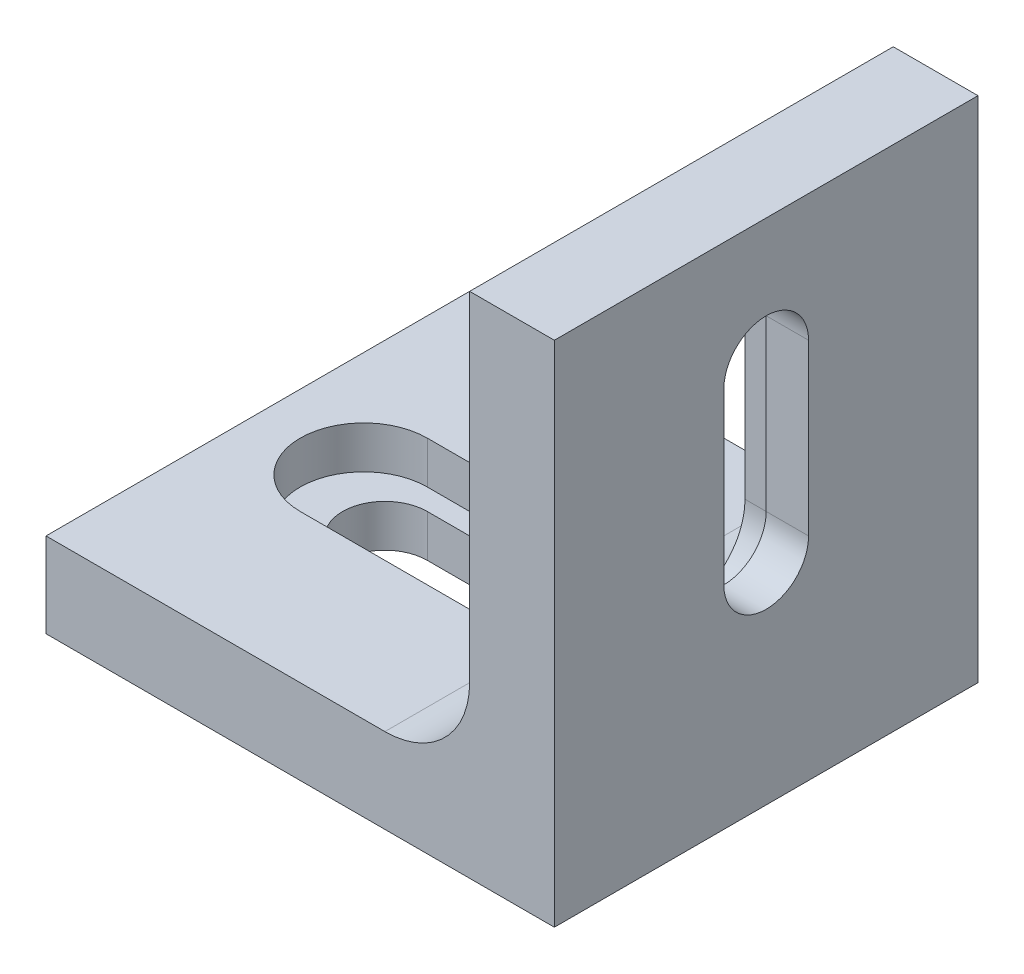
ISO-10303-21;
HEADER;
FILE_DESCRIPTION(('STEP AP214'),'2;1');
FILE_NAME('part.step','',(''),(''),'','','');
FILE_SCHEMA(('AUTOMOTIVE_DESIGN { 1 0 10303 214 1 1 1 1 }'));
ENDSEC;
DATA;
#1=APPLICATION_CONTEXT('core data for automotive mechanical design processes');
#2=APPLICATION_PROTOCOL_DEFINITION('international standard','automotive_design',2000,#1);
#3=PRODUCT_CONTEXT('',#1,'mechanical');
#4=PRODUCT('Part','Part','',(#3));
#5=PRODUCT_RELATED_PRODUCT_CATEGORY('part','',(#4));
#6=PRODUCT_DEFINITION_FORMATION('','',#4);
#7=PRODUCT_DEFINITION_CONTEXT('part definition',#1,'design');
#8=PRODUCT_DEFINITION('design','',#6,#7);
#9=PRODUCT_DEFINITION_SHAPE('','',#8);
#10=(LENGTH_UNIT() NAMED_UNIT(*) SI_UNIT(.MILLI.,.METRE.));
#11=(NAMED_UNIT(*) PLANE_ANGLE_UNIT() SI_UNIT($,.RADIAN.));
#12=(NAMED_UNIT(*) SI_UNIT($,.STERADIAN.) SOLID_ANGLE_UNIT());
#13=UNCERTAINTY_MEASURE_WITH_UNIT(LENGTH_MEASURE(1.E-05),#10,'distance_accuracy_value','');
#14=(GEOMETRIC_REPRESENTATION_CONTEXT(3) GLOBAL_UNCERTAINTY_ASSIGNED_CONTEXT((#13)) GLOBAL_UNIT_ASSIGNED_CONTEXT((#10,
#11,#12)) REPRESENTATION_CONTEXT('',''));
#15=CARTESIAN_POINT('',(0.,0.,0.));
#16=DIRECTION('',(0.,0.,1.));
#17=DIRECTION('',(1.,0.,0.));
#18=AXIS2_PLACEMENT_3D('',#15,#16,#17);
#19=CARTESIAN_POINT('',(6.,4.,-2.82842712474619));
#20=CARTESIAN_POINT('',(6.32547245768448,3.99999999999985,-2.71335420445476));
#21=CARTESIAN_POINT('',(6.52626989180735,3.99999999999995,-2.59121849655691));
#22=CARTESIAN_POINT('',(6.87169266852622,4.00000000000005,-2.35386496467723));
#23=CARTESIAN_POINT('',(7.00802456175947,3.9999999999999,-2.23515176195307));
#24=CARTESIAN_POINT('',(7.36258704874638,4.00000000000021,-1.87894844635528));
#25=CARTESIAN_POINT('',(7.52548771713491,4.,-1.64139510733595));
#26=CARTESIAN_POINT('',(7.90286763863255,4.,-0.928668009226681));
#27=CARTESIAN_POINT('',(8.00333836321145,4.,-0.453393464153569));
#28=CARTESIAN_POINT('',(7.99992241701403,4.,0.0215752612197073));
#29=CARTESIAN_POINT('',(10.,4.,-2.82842712474601));
#30=CARTESIAN_POINT('',(9.71487356592762,4.28512643407233,-2.7273002631504));
#31=CARTESIAN_POINT('',(9.60723789388118,4.39276210611887,-2.5939879391275));
#32=CARTESIAN_POINT('',(9.46755166552284,4.53244833447711,-2.35619334515371));
#33=CARTESIAN_POINT('',(9.43364752556639,4.56635247443346,-2.235994661148));
#34=CARTESIAN_POINT('',(9.36637159728851,4.63362840271179,-1.88447695941089));
#35=CARTESIAN_POINT('',(9.36211473761488,4.63788526238491,-1.64293526307065));
#36=CARTESIAN_POINT('',(9.36064682971252,4.63935317028788,-0.937725971722477));
#37=CARTESIAN_POINT('',(9.37828061713114,4.62171938286743,-0.452275232150626));
#38=CARTESIAN_POINT('',(9.37795520933664,4.62204479066336,0.023266220371759));
#39=CARTESIAN_POINT('',(10.,8.,-2.8284271247462));
#40=CARTESIAN_POINT('',(10.0000000000001,7.67452754231554,-2.71335420445469));
#41=CARTESIAN_POINT('',(10.,7.47373010819264,-2.59121849655694));
#42=CARTESIAN_POINT('',(10.,7.12830733147378,-2.3538649646772));
#43=CARTESIAN_POINT('',(9.9999999999999,6.99197543824052,-2.23515176195312));
#44=CARTESIAN_POINT('',(10.0000000000002,6.63741295125362,-1.87894844635518));
#45=CARTESIAN_POINT('',(9.9999999999998,6.47451228286488,-1.64139510733587));
#46=CARTESIAN_POINT('',(10.0000000000004,6.09713236136785,-0.928668009226834));
#47=CARTESIAN_POINT('',(9.99999999999836,5.99666163679081,-0.453393464153489));
#48=CARTESIAN_POINT('',(10.,6.00007758298597,0.0215752612197117));
#49=(BOUNDED_SURFACE() B_SPLINE_SURFACE(2,3,((#19,#20,#21,#22,#23,#24,#25,#26,#27,#28),(#29,#30,
#31,#32,#33,#34,#35,#36,#37,#38),(#39,#40,#41,#42,#43,#44,#45,#46,#47,#48)),.UNSPECIFIED.,.F.,
.F.,.F.) B_SPLINE_SURFACE_WITH_KNOTS((3,3),(4,2,2,2,4),(0.,1.),(0.,0.00039540465339184,
0.000790809306783114,0.00158161861356566,0.00316323722713076),
.UNSPECIFIED.) GEOMETRIC_REPRESENTATION_ITEM() RATIONAL_B_SPLINE_SURFACE(((1.,1.,1.,1.,1.,1.,1.,
1.,1.,1.),(0.707106781186547,0.76325819999472,0.790142989257354,0.834021234709495,
0.849023521785395,0.885991013362996,0.89958165536525,0.930028834842952,0.934909669010495,
0.935409162847284),(1.,1.,1.,1.,1.,1.,1.,1.,1.,1.))) REPRESENTATION_ITEM('') SURFACE());
#50=CARTESIAN_POINT('',(10.,6.00007758298597,0.0215752612197117));
#51=CARTESIAN_POINT('',(9.37795520933664,4.62204479066336,0.0232662203716718));
#52=CARTESIAN_POINT('',(7.99992241701403,4.,0.0215752612197073));
#53=(BOUNDED_CURVE() B_SPLINE_CURVE(2,(#50,#51,#52),.UNSPECIFIED.,.F.,
.F.) B_SPLINE_CURVE_WITH_KNOTS((3,3),(0.,1.),
.UNSPECIFIED.) CURVE() GEOMETRIC_REPRESENTATION_ITEM() RATIONAL_B_SPLINE_CURVE((1.,
0.935409162847284,1.)) REPRESENTATION_ITEM(''));
#54=CARTESIAN_POINT('',(10.,6.00007758298597,0.0215752612197117));
#55=VERTEX_POINT('',#54);
#56=CARTESIAN_POINT('',(7.99992241701403,4.,0.0215752612197073));
#57=VERTEX_POINT('',#56);
#58=EDGE_CURVE('E11',#55,#57,#53,.T.);
#59=CARTESIAN_POINT('',(10.,6.00007758298597,0.0215752612197117));
#60=CARTESIAN_POINT('',(9.99999999999836,5.99666163679081,-0.453393464153489));
#61=CARTESIAN_POINT('',(10.0000000000004,6.09713236136785,-0.928668009226834));
#62=CARTESIAN_POINT('',(9.9999999999998,6.47451228286488,-1.64139510733587));
#63=CARTESIAN_POINT('',(10.0000000000002,6.63741295125362,-1.87894844635518));
#64=CARTESIAN_POINT('',(9.9999999999999,6.99197543824052,-2.23515176195312));
#65=CARTESIAN_POINT('',(10.,7.12830733147378,-2.3538649646772));
#66=CARTESIAN_POINT('',(10.,7.47373010819264,-2.59121849655694));
#67=CARTESIAN_POINT('',(10.0000000000001,7.67452754231554,-2.71335420445469));
#68=CARTESIAN_POINT('',(10.,8.,-2.8284271247462));
#69=(BOUNDED_CURVE() B_SPLINE_CURVE(3,(#59,#60,#61,#62,#63,#64,#65,#66,#67,#68),.UNSPECIFIED.,
.F.,.F.) B_SPLINE_CURVE_WITH_KNOTS((4,2,2,2,4),(0.,0.00158161861356566,0.00237242792034821,
0.00276783257373948,0.00316323722713076),
.UNSPECIFIED.) CURVE() GEOMETRIC_REPRESENTATION_ITEM() RATIONAL_B_SPLINE_CURVE((1.,1.,1.,1.,1.,
1.,1.,1.,1.,1.)) REPRESENTATION_ITEM(''));
#70=CARTESIAN_POINT('',(10.,8.,-2.8284271247462));
#71=VERTEX_POINT('',#70);
#72=EDGE_CURVE('E290',#71,#55,#69,.F.);
#73=CARTESIAN_POINT('',(10.,8.,-2.8284271247462));
#74=CARTESIAN_POINT('',(10.,4.,-2.82842712474601));
#75=CARTESIAN_POINT('',(6.,4.,-2.82842712474619));
#76=(BOUNDED_CURVE() B_SPLINE_CURVE(2,(#73,#74,#75),.UNSPECIFIED.,.F.,
.F.) B_SPLINE_CURVE_WITH_KNOTS((3,3),(0.,1.),
.UNSPECIFIED.) CURVE() GEOMETRIC_REPRESENTATION_ITEM() RATIONAL_B_SPLINE_CURVE((1.,
0.707106781186547,1.)) REPRESENTATION_ITEM(''));
#77=CARTESIAN_POINT('',(6.,4.,-2.82842712474619));
#78=VERTEX_POINT('',#77);
#79=EDGE_CURVE('E640',#78,#71,#76,.F.);
#80=CARTESIAN_POINT('',(6.,4.,-2.82842712474619));
#81=CARTESIAN_POINT('',(6.32547245768448,3.99999999999985,-2.71335420445476));
#82=CARTESIAN_POINT('',(6.52626989180735,3.99999999999995,-2.59121849655691));
#83=CARTESIAN_POINT('',(6.87169266852622,4.00000000000005,-2.35386496467723));
#84=CARTESIAN_POINT('',(7.00802456175947,3.9999999999999,-2.23515176195307));
#85=CARTESIAN_POINT('',(7.36258704874638,4.00000000000021,-1.87894844635528));
#86=CARTESIAN_POINT('',(7.52548771713491,4.,-1.64139510733595));
#87=CARTESIAN_POINT('',(7.90286763863255,4.,-0.928668009226681));
#88=CARTESIAN_POINT('',(8.00333836321145,4.,-0.453393464153569));
#89=CARTESIAN_POINT('',(7.99992241701403,4.,0.0215752612197073));
#90=(BOUNDED_CURVE() B_SPLINE_CURVE(3,(#80,#81,#82,#83,#84,#85,#86,#87,#88,#89),.UNSPECIFIED.,
.F.,.F.) B_SPLINE_CURVE_WITH_KNOTS((4,2,2,2,4),(0.,0.00039540465339184,0.000790809306783114,
0.00158161861356566,0.00316323722713076),
.UNSPECIFIED.) CURVE() GEOMETRIC_REPRESENTATION_ITEM() RATIONAL_B_SPLINE_CURVE((1.,1.,1.,1.,1.,
1.,1.,1.,1.,1.)) REPRESENTATION_ITEM(''));
#91=EDGE_CURVE('E80',#57,#78,#90,.F.);
#92=ORIENTED_EDGE('',*,*,#58,.F.);
#93=ORIENTED_EDGE('',*,*,#72,.F.);
#94=ORIENTED_EDGE('',*,*,#79,.F.);
#95=ORIENTED_EDGE('',*,*,#91,.F.);
#96=EDGE_LOOP('',(#92,#93,#94,#95));
#97=FACE_BOUND('',#96,.T.);
#98=ADVANCED_FACE('F42',(#97),#49,.F.);
#99=CARTESIAN_POINT('',(0.,4.,0.));
#100=DIRECTION('',(0.,-1.,0.));
#101=DIRECTION('',(0.,0.,-1.));
#102=AXIS2_PLACEMENT_3D('',#99,#100,#101);
#103=PLANE('',#102);
#104=DIRECTION('',(1.,0.,0.));
#105=VECTOR('',#104,1.);
#106=CARTESIAN_POINT('',(-10.,4.,10.));
#107=LINE('',#106,#105);
#108=CARTESIAN_POINT('',(-10.,4.,10.));
#109=VERTEX_POINT('',#108);
#110=CARTESIAN_POINT('',(6.,4.,10.));
#111=VERTEX_POINT('',#110);
#112=EDGE_CURVE('E326',#109,#111,#107,.T.);
#113=ORIENTED_EDGE('',*,*,#112,.T.);
#114=DIRECTION('',(0.,0.,1.));
#115=VECTOR('',#114,1.);
#116=CARTESIAN_POINT('',(6.,4.,-10.));
#117=LINE('',#116,#115);
#118=CARTESIAN_POINT('',(6.,4.,2.82842712474619));
#119=VERTEX_POINT('',#118);
#120=EDGE_CURVE('E311',#111,#119,#117,.F.);
#121=ORIENTED_EDGE('',*,*,#120,.T.);
#122=CARTESIAN_POINT('',(5.,4.,0.));
#123=DIRECTION('',(0.,1.,0.));
#124=DIRECTION('',(0.,0.,1.));
#125=AXIS2_PLACEMENT_3D('',#122,#123,#124);
#126=CIRCLE('',#125,3.);
#127=CARTESIAN_POINT('',(5.,4.,3.));
#128=VERTEX_POINT('',#127);
#129=EDGE_CURVE('E305',#128,#119,#126,.T.);
#130=ORIENTED_EDGE('',*,*,#129,.F.);
#131=DIRECTION('',(1.,0.,0.));
#132=VECTOR('',#131,1.);
#133=CARTESIAN_POINT('',(-5.,4.,3.));
#134=LINE('',#133,#132);
#135=CARTESIAN_POINT('',(-5.,4.,3.));
#136=VERTEX_POINT('',#135);
#137=EDGE_CURVE('E296',#136,#128,#134,.T.);
#138=ORIENTED_EDGE('',*,*,#137,.F.);
#139=CARTESIAN_POINT('',(-5.,4.,0.));
#140=DIRECTION('',(0.,1.,0.));
#141=DIRECTION('',(0.,0.,1.));
#142=AXIS2_PLACEMENT_3D('',#139,#140,#141);
#143=CIRCLE('',#142,3.);
#144=CARTESIAN_POINT('',(-5.,4.,-3.));
#145=VERTEX_POINT('',#144);
#146=EDGE_CURVE('E382',#145,#136,#143,.T.);
#147=ORIENTED_EDGE('',*,*,#146,.F.);
#148=DIRECTION('',(-1.,0.,0.));
#149=VECTOR('',#148,1.);
#150=CARTESIAN_POINT('',(-5.,4.,-3.));
#151=LINE('',#150,#149);
#152=CARTESIAN_POINT('',(5.,4.,-3.));
#153=VERTEX_POINT('',#152);
#154=EDGE_CURVE('E302',#153,#145,#151,.T.);
#155=ORIENTED_EDGE('',*,*,#154,.F.);
#156=EDGE_CURVE('E293',#78,#153,#126,.T.);
#157=ORIENTED_EDGE('',*,*,#156,.F.);
#158=DIRECTION('',(0.,0.,1.));
#159=VECTOR('',#158,1.);
#160=CARTESIAN_POINT('',(6.,4.,-10.));
#161=LINE('',#160,#159);
#162=CARTESIAN_POINT('',(6.,4.,-10.));
#163=VERTEX_POINT('',#162);
#164=EDGE_CURVE('E88',#78,#163,#161,.F.);
#165=ORIENTED_EDGE('',*,*,#164,.T.);
#166=DIRECTION('',(-1.,0.,0.));
#167=VECTOR('',#166,1.);
#168=CARTESIAN_POINT('',(-10.,4.,-10.));
#169=LINE('',#168,#167);
#170=CARTESIAN_POINT('',(-10.,4.,-10.));
#171=VERTEX_POINT('',#170);
#172=EDGE_CURVE('E329',#163,#171,#169,.T.);
#173=ORIENTED_EDGE('',*,*,#172,.T.);
#174=DIRECTION('',(0.,0.,1.));
#175=VECTOR('',#174,1.);
#176=CARTESIAN_POINT('',(-10.,4.,10.));
#177=LINE('',#176,#175);
#178=EDGE_CURVE('E337',#171,#109,#177,.T.);
#179=ORIENTED_EDGE('',*,*,#178,.T.);
#180=EDGE_LOOP('',(#113,#121,#130,#138,#147,#155,#157,#165,#173,#179));
#181=FACE_BOUND('',#180,.T.);
#182=ADVANCED_FACE('F391',(#181),#103,.F.);
#183=CARTESIAN_POINT('',(-4.,4.,0.));
#184=DIRECTION('',(0.,-1.,0.));
#185=DIRECTION('',(0.,0.,-1.));
#186=AXIS2_PLACEMENT_3D('',#183,#184,#185);
#187=CYLINDRICAL_SURFACE('',#186,2.);
#188=DIRECTION('',(0.,-1.,0.));
#189=VECTOR('',#188,1.);
#190=CARTESIAN_POINT('',(-4.,4.,-2.));
#191=LINE('',#190,#189);
#192=CARTESIAN_POINT('',(-4.,2.,-2.));
#193=VERTEX_POINT('',#192);
#194=CARTESIAN_POINT('',(-4.,0.,-2.));
#195=VERTEX_POINT('',#194);
#196=EDGE_CURVE('E345',#193,#195,#191,.T.);
#197=ORIENTED_EDGE('',*,*,#196,.F.);
#198=CARTESIAN_POINT('',(-4.,2.,0.));
#199=DIRECTION('',(0.,1.,0.));
#200=DIRECTION('',(0.,0.,1.));
#201=AXIS2_PLACEMENT_3D('',#198,#199,#200);
#202=CIRCLE('',#201,2.);
#203=CARTESIAN_POINT('',(-4.,2.,2.));
#204=VERTEX_POINT('',#203);
#205=EDGE_CURVE('E359',#193,#204,#202,.T.);
#206=ORIENTED_EDGE('',*,*,#205,.T.);
#207=DIRECTION('',(0.,-1.,0.));
#208=VECTOR('',#207,1.);
#209=CARTESIAN_POINT('',(-4.,4.,2.));
#210=LINE('',#209,#208);
#211=CARTESIAN_POINT('',(-4.,0.,2.));
#212=VERTEX_POINT('',#211);
#213=EDGE_CURVE('E334',#204,#212,#210,.T.);
#214=ORIENTED_EDGE('',*,*,#213,.T.);
#215=CARTESIAN_POINT('',(-4.,0.,0.));
#216=DIRECTION('',(0.,1.,0.));
#217=DIRECTION('',(0.,0.,1.));
#218=AXIS2_PLACEMENT_3D('',#215,#216,#217);
#219=CIRCLE('',#218,2.);
#220=EDGE_CURVE('E356',#195,#212,#219,.T.);
#221=ORIENTED_EDGE('',*,*,#220,.F.);
#222=EDGE_LOOP('',(#197,#206,#214,#221));
#223=FACE_BOUND('',#222,.T.);
#224=ADVANCED_FACE('F599',(#223),#187,.F.);
#225=CARTESIAN_POINT('',(-4.,4.,2.));
#226=DIRECTION('',(0.,0.,-1.));
#227=DIRECTION('',(-1.,0.,0.));
#228=AXIS2_PLACEMENT_3D('',#225,#226,#227);
#229=PLANE('',#228);
#230=ORIENTED_EDGE('',*,*,#213,.F.);
#231=DIRECTION('',(1.,0.,0.));
#232=VECTOR('',#231,1.);
#233=CARTESIAN_POINT('',(-4.,2.,2.));
#234=LINE('',#233,#232);
#235=CARTESIAN_POINT('',(4.,2.,2.));
#236=VERTEX_POINT('',#235);
#237=EDGE_CURVE('E362',#204,#236,#234,.T.);
#238=ORIENTED_EDGE('',*,*,#237,.T.);
#239=DIRECTION('',(0.,-1.,0.));
#240=VECTOR('',#239,1.);
#241=CARTESIAN_POINT('',(4.,4.,2.));
#242=LINE('',#241,#240);
#243=CARTESIAN_POINT('',(4.,0.,2.));
#244=VERTEX_POINT('',#243);
#245=EDGE_CURVE('E341',#236,#244,#242,.T.);
#246=ORIENTED_EDGE('',*,*,#245,.T.);
#247=DIRECTION('',(1.,0.,0.));
#248=VECTOR('',#247,1.);
#249=CARTESIAN_POINT('',(-4.,0.,2.));
#250=LINE('',#249,#248);
#251=EDGE_CURVE('E353',#212,#244,#250,.T.);
#252=ORIENTED_EDGE('',*,*,#251,.F.);
#253=EDGE_LOOP('',(#230,#238,#246,#252));
#254=FACE_BOUND('',#253,.T.);
#255=ADVANCED_FACE('F669',(#254),#229,.T.);
#256=CARTESIAN_POINT('',(4.,4.,0.));
#257=DIRECTION('',(0.,-1.,0.));
#258=DIRECTION('',(0.,0.,-1.));
#259=AXIS2_PLACEMENT_3D('',#256,#257,#258);
#260=CYLINDRICAL_SURFACE('',#259,2.);
#261=ORIENTED_EDGE('',*,*,#245,.F.);
#262=CARTESIAN_POINT('',(4.,2.,0.));
#263=DIRECTION('',(0.,1.,0.));
#264=DIRECTION('',(0.,0.,1.));
#265=AXIS2_PLACEMENT_3D('',#262,#263,#264);
#266=CIRCLE('',#265,2.);
#267=CARTESIAN_POINT('',(4.,2.,-2.));
#268=VERTEX_POINT('',#267);
#269=EDGE_CURVE('E365',#236,#268,#266,.T.);
#270=ORIENTED_EDGE('',*,*,#269,.T.);
#271=DIRECTION('',(0.,-1.,0.));
#272=VECTOR('',#271,1.);
#273=CARTESIAN_POINT('',(4.,4.,-2.));
#274=LINE('',#273,#272);
#275=CARTESIAN_POINT('',(4.,0.,-2.));
#276=VERTEX_POINT('',#275);
#277=EDGE_CURVE('E343',#268,#276,#274,.T.);
#278=ORIENTED_EDGE('',*,*,#277,.T.);
#279=CARTESIAN_POINT('',(4.,0.,0.));
#280=DIRECTION('',(0.,1.,0.));
#281=DIRECTION('',(0.,0.,1.));
#282=AXIS2_PLACEMENT_3D('',#279,#280,#281);
#283=CIRCLE('',#282,2.);
#284=EDGE_CURVE('E350',#244,#276,#283,.T.);
#285=ORIENTED_EDGE('',*,*,#284,.F.);
#286=EDGE_LOOP('',(#261,#270,#278,#285));
#287=FACE_BOUND('',#286,.T.);
#288=ADVANCED_FACE('F673',(#287),#260,.F.);
#289=CARTESIAN_POINT('',(-4.,4.,-2.));
#290=DIRECTION('',(0.,0.,1.));
#291=DIRECTION('',(1.,0.,0.));
#292=AXIS2_PLACEMENT_3D('',#289,#290,#291);
#293=PLANE('',#292);
#294=ORIENTED_EDGE('',*,*,#277,.F.);
#295=DIRECTION('',(-1.,0.,0.));
#296=VECTOR('',#295,1.);
#297=CARTESIAN_POINT('',(-4.,2.,-2.));
#298=LINE('',#297,#296);
#299=EDGE_CURVE('E316',#268,#193,#298,.T.);
#300=ORIENTED_EDGE('',*,*,#299,.T.);
#301=ORIENTED_EDGE('',*,*,#196,.T.);
#302=DIRECTION('',(-1.,0.,0.));
#303=VECTOR('',#302,1.);
#304=CARTESIAN_POINT('',(-4.,0.,-2.));
#305=LINE('',#304,#303);
#306=EDGE_CURVE('E347',#276,#195,#305,.T.);
#307=ORIENTED_EDGE('',*,*,#306,.F.);
#308=EDGE_LOOP('',(#294,#300,#301,#307));
#309=FACE_BOUND('',#308,.T.);
#310=ADVANCED_FACE('F664',(#309),#293,.T.);
#311=CARTESIAN_POINT('',(0.,0.,0.));
#312=DIRECTION('',(0.,-1.,0.));
#313=DIRECTION('',(0.,0.,-1.));
#314=AXIS2_PLACEMENT_3D('',#311,#312,#313);
#315=PLANE('',#314);
#316=DIRECTION('',(-1.,0.,0.));
#317=VECTOR('',#316,1.);
#318=CARTESIAN_POINT('',(-10.,0.,-10.));
#319=LINE('',#318,#317);
#320=CARTESIAN_POINT('',(14.,0.,-10.));
#321=VERTEX_POINT('',#320);
#322=CARTESIAN_POINT('',(-10.,0.,-10.));
#323=VERTEX_POINT('',#322);
#324=EDGE_CURVE('E332',#321,#323,#319,.T.);
#325=ORIENTED_EDGE('',*,*,#324,.F.);
#326=DIRECTION('',(0.,0.,-1.));
#327=VECTOR('',#326,1.);
#328=CARTESIAN_POINT('',(14.,0.,10.));
#329=LINE('',#328,#327);
#330=CARTESIAN_POINT('',(14.,0.,10.));
#331=VERTEX_POINT('',#330);
#332=EDGE_CURVE('E394',#331,#321,#329,.T.);
#333=ORIENTED_EDGE('',*,*,#332,.F.);
#334=DIRECTION('',(1.,0.,0.));
#335=VECTOR('',#334,1.);
#336=CARTESIAN_POINT('',(-10.,0.,10.));
#337=LINE('',#336,#335);
#338=CARTESIAN_POINT('',(-10.,0.,10.));
#339=VERTEX_POINT('',#338);
#340=EDGE_CURVE('E327',#339,#331,#337,.T.);
#341=ORIENTED_EDGE('',*,*,#340,.F.);
#342=DIRECTION('',(0.,0.,1.));
#343=VECTOR('',#342,1.);
#344=CARTESIAN_POINT('',(-10.,0.,10.));
#345=LINE('',#344,#343);
#346=EDGE_CURVE('E330',#323,#339,#345,.T.);
#347=ORIENTED_EDGE('',*,*,#346,.F.);
#348=EDGE_LOOP('',(#325,#333,#341,#347));
#349=FACE_BOUND('',#348,.T.);
#350=ORIENTED_EDGE('',*,*,#306,.T.);
#351=ORIENTED_EDGE('',*,*,#220,.T.);
#352=ORIENTED_EDGE('',*,*,#251,.T.);
#353=ORIENTED_EDGE('',*,*,#284,.T.);
#354=EDGE_LOOP('',(#350,#351,#352,#353));
#355=FACE_BOUND('',#354,.T.);
#356=ADVANCED_FACE('F657',(#349,#355),#315,.T.);
#357=CARTESIAN_POINT('',(-10.,4.,-10.));
#358=DIRECTION('',(0.,0.,1.));
#359=DIRECTION('',(1.,0.,0.));
#360=AXIS2_PLACEMENT_3D('',#357,#358,#359);
#361=PLANE('',#360);
#362=ORIENTED_EDGE('',*,*,#324,.T.);
#363=DIRECTION('',(0.,-1.,0.));
#364=VECTOR('',#363,1.);
#365=CARTESIAN_POINT('',(-10.,4.,-10.));
#366=LINE('',#365,#364);
#367=EDGE_CURVE('E320',#171,#323,#366,.T.);
#368=ORIENTED_EDGE('',*,*,#367,.F.);
#369=ORIENTED_EDGE('',*,*,#172,.F.);
#370=CARTESIAN_POINT('',(6.,8.,-10.));
#371=DIRECTION('',(0.,0.,1.));
#372=DIRECTION('',(1.,0.,0.));
#373=AXIS2_PLACEMENT_3D('',#370,#371,#372);
#374=CIRCLE('',#373,4.);
#375=CARTESIAN_POINT('',(10.,8.,-10.));
#376=VERTEX_POINT('',#375);
#377=EDGE_CURVE('E56',#163,#376,#374,.T.);
#378=ORIENTED_EDGE('',*,*,#377,.T.);
#379=DIRECTION('',(0.,-1.,0.));
#380=VECTOR('',#379,1.);
#381=CARTESIAN_POINT('',(10.,24.,-10.));
#382=LINE('',#381,#380);
#383=CARTESIAN_POINT('',(10.,24.,-10.));
#384=VERTEX_POINT('',#383);
#385=EDGE_CURVE('E411',#384,#376,#382,.T.);
#386=ORIENTED_EDGE('',*,*,#385,.F.);
#387=DIRECTION('',(-1.,0.,0.));
#388=VECTOR('',#387,1.);
#389=CARTESIAN_POINT('',(14.,24.,-10.));
#390=LINE('',#389,#388);
#391=CARTESIAN_POINT('',(14.,24.,-10.));
#392=VERTEX_POINT('',#391);
#393=EDGE_CURVE('E422',#392,#384,#390,.T.);
#394=ORIENTED_EDGE('',*,*,#393,.F.);
#395=DIRECTION('',(0.,1.,0.));
#396=VECTOR('',#395,1.);
#397=CARTESIAN_POINT('',(14.,0.,-10.));
#398=LINE('',#397,#396);
#399=EDGE_CURVE('E409',#321,#392,#398,.T.);
#400=ORIENTED_EDGE('',*,*,#399,.F.);
#401=EDGE_LOOP('',(#362,#368,#369,#378,#386,#394,#400));
#402=FACE_BOUND('',#401,.T.);
#403=ADVANCED_FACE('F653',(#402),#361,.F.);
#404=CARTESIAN_POINT('',(-10.,4.,10.));
#405=DIRECTION('',(1.,0.,0.));
#406=DIRECTION('',(0.,0.,-1.));
#407=AXIS2_PLACEMENT_3D('',#404,#405,#406);
#408=PLANE('',#407);
#409=ORIENTED_EDGE('',*,*,#346,.T.);
#410=DIRECTION('',(0.,-1.,0.));
#411=VECTOR('',#410,1.);
#412=CARTESIAN_POINT('',(-10.,4.,10.));
#413=LINE('',#412,#411);
#414=EDGE_CURVE('E323',#109,#339,#413,.T.);
#415=ORIENTED_EDGE('',*,*,#414,.F.);
#416=ORIENTED_EDGE('',*,*,#178,.F.);
#417=ORIENTED_EDGE('',*,*,#367,.T.);
#418=EDGE_LOOP('',(#409,#415,#416,#417));
#419=FACE_BOUND('',#418,.T.);
#420=ADVANCED_FACE('F656',(#419),#408,.F.);
#421=CARTESIAN_POINT('',(-10.,4.,10.));
#422=DIRECTION('',(0.,0.,-1.));
#423=DIRECTION('',(-1.,0.,0.));
#424=AXIS2_PLACEMENT_3D('',#421,#422,#423);
#425=PLANE('',#424);
#426=ORIENTED_EDGE('',*,*,#340,.T.);
#427=DIRECTION('',(0.,-1.,0.));
#428=VECTOR('',#427,1.);
#429=CARTESIAN_POINT('',(14.,0.,10.));
#430=LINE('',#429,#428);
#431=CARTESIAN_POINT('',(14.,24.,10.));
#432=VERTEX_POINT('',#431);
#433=EDGE_CURVE('E396',#432,#331,#430,.T.);
#434=ORIENTED_EDGE('',*,*,#433,.F.);
#435=DIRECTION('',(1.,0.,0.));
#436=VECTOR('',#435,1.);
#437=CARTESIAN_POINT('',(14.,24.,10.));
#438=LINE('',#437,#436);
#439=CARTESIAN_POINT('',(10.,24.,10.));
#440=VERTEX_POINT('',#439);
#441=EDGE_CURVE('E417',#440,#432,#438,.T.);
#442=ORIENTED_EDGE('',*,*,#441,.F.);
#443=DIRECTION('',(0.,-1.,0.));
#444=VECTOR('',#443,1.);
#445=CARTESIAN_POINT('',(10.,24.,10.));
#446=LINE('',#445,#444);
#447=CARTESIAN_POINT('',(10.,8.,10.));
#448=VERTEX_POINT('',#447);
#449=EDGE_CURVE('E414',#440,#448,#446,.T.);
#450=ORIENTED_EDGE('',*,*,#449,.T.);
#451=CARTESIAN_POINT('',(6.,8.,10.));
#452=DIRECTION('',(0.,0.,-1.));
#453=DIRECTION('',(-1.,0.,0.));
#454=AXIS2_PLACEMENT_3D('',#451,#452,#453);
#455=CIRCLE('',#454,4.);
#456=EDGE_CURVE('E313',#448,#111,#455,.T.);
#457=ORIENTED_EDGE('',*,*,#456,.T.);
#458=ORIENTED_EDGE('',*,*,#112,.F.);
#459=ORIENTED_EDGE('',*,*,#414,.T.);
#460=EDGE_LOOP('',(#426,#434,#442,#450,#457,#458,#459));
#461=FACE_BOUND('',#460,.T.);
#462=ADVANCED_FACE('F571',(#461),#425,.F.);
#463=CARTESIAN_POINT('',(-5.,2.,0.));
#464=DIRECTION('',(0.,1.,0.));
#465=DIRECTION('',(0.,0.,1.));
#466=AXIS2_PLACEMENT_3D('',#463,#464,#465);
#467=CYLINDRICAL_SURFACE('',#466,3.);
#468=ORIENTED_EDGE('',*,*,#146,.T.);
#469=DIRECTION('',(0.,1.,0.));
#470=VECTOR('',#469,1.);
#471=CARTESIAN_POINT('',(-5.,2.,3.));
#472=LINE('',#471,#470);
#473=CARTESIAN_POINT('',(-5.,2.,3.));
#474=VERTEX_POINT('',#473);
#475=EDGE_CURVE('E369',#474,#136,#472,.T.);
#476=ORIENTED_EDGE('',*,*,#475,.F.);
#477=CARTESIAN_POINT('',(-5.,2.,0.));
#478=DIRECTION('',(0.,1.,0.));
#479=DIRECTION('',(0.,0.,1.));
#480=AXIS2_PLACEMENT_3D('',#477,#478,#479);
#481=CIRCLE('',#480,3.);
#482=CARTESIAN_POINT('',(-5.,2.,-3.));
#483=VERTEX_POINT('',#482);
#484=EDGE_CURVE('E384',#483,#474,#481,.T.);
#485=ORIENTED_EDGE('',*,*,#484,.F.);
#486=DIRECTION('',(0.,1.,0.));
#487=VECTOR('',#486,1.);
#488=CARTESIAN_POINT('',(-5.,2.,-3.));
#489=LINE('',#488,#487);
#490=EDGE_CURVE('E368',#483,#145,#489,.T.);
#491=ORIENTED_EDGE('',*,*,#490,.T.);
#492=EDGE_LOOP('',(#468,#476,#485,#491));
#493=FACE_BOUND('',#492,.T.);
#494=ADVANCED_FACE('F380',(#493),#467,.F.);
#495=CARTESIAN_POINT('',(-5.,2.,-3.));
#496=DIRECTION('',(0.,0.,-1.));
#497=DIRECTION('',(-1.,0.,0.));
#498=AXIS2_PLACEMENT_3D('',#495,#496,#497);
#499=PLANE('',#498);
#500=ORIENTED_EDGE('',*,*,#154,.T.);
#501=ORIENTED_EDGE('',*,*,#490,.F.);
#502=DIRECTION('',(-1.,0.,0.));
#503=VECTOR('',#502,1.);
#504=CARTESIAN_POINT('',(-5.,2.,-3.));
#505=LINE('',#504,#503);
#506=CARTESIAN_POINT('',(5.,2.,-3.));
#507=VERTEX_POINT('',#506);
#508=EDGE_CURVE('E373',#507,#483,#505,.T.);
#509=ORIENTED_EDGE('',*,*,#508,.F.);
#510=DIRECTION('',(0.,1.,0.));
#511=VECTOR('',#510,1.);
#512=CARTESIAN_POINT('',(5.,2.,-3.));
#513=LINE('',#512,#511);
#514=EDGE_CURVE('E375',#507,#153,#513,.T.);
#515=ORIENTED_EDGE('',*,*,#514,.T.);
#516=EDGE_LOOP('',(#500,#501,#509,#515));
#517=FACE_BOUND('',#516,.T.);
#518=ADVANCED_FACE('F389',(#517),#499,.F.);
#519=CARTESIAN_POINT('',(5.,2.,0.));
#520=DIRECTION('',(0.,1.,0.));
#521=DIRECTION('',(0.,0.,1.));
#522=AXIS2_PLACEMENT_3D('',#519,#520,#521);
#523=CYLINDRICAL_SURFACE('',#522,3.);
#524=ORIENTED_EDGE('',*,*,#129,.T.);
#525=CARTESIAN_POINT('',(7.99992241701403,4.,0.0215752612197073));
#526=CARTESIAN_POINT('',(7.99655780397247,3.9999999999998,0.489406393847172));
#527=CARTESIAN_POINT('',(7.89251532351298,4.00000000000021,0.956942216341228));
#528=CARTESIAN_POINT('',(7.51400031076357,3.9999999999999,1.658432443956));
#529=CARTESIAN_POINT('',(7.35142896395605,3.9999999999999,1.89228535250882));
#530=CARTESIAN_POINT('',(6.99889606364039,4.00000000000005,2.24319077819157));
#531=CARTESIAN_POINT('',(6.86348952920445,3.99999999999995,2.3601803860819));
#532=CARTESIAN_POINT('',(6.52085658895563,4.00000000000005,2.59423192543343));
#533=CARTESIAN_POINT('',(6.3217072994237,3.99999999999975,2.71468540927684));
#534=CARTESIAN_POINT('',(6.,4.,2.82842712474619));
#535=(BOUNDED_CURVE() B_SPLINE_CURVE(3,(#525,#526,#527,#528,#529,#530,#531,#532,#533,#534),
.UNSPECIFIED.,.F.,.F.) B_SPLINE_CURVE_WITH_KNOTS((4,2,2,2,4),(6.28002206995246,6.28160368856602,
6.2823944978728,6.2827899025262,6.28318530717959),
.UNSPECIFIED.) CURVE() GEOMETRIC_REPRESENTATION_ITEM() RATIONAL_B_SPLINE_CURVE((1.,1.,1.,1.,1.,
1.,1.,1.,1.,1.)) REPRESENTATION_ITEM(''));
#536=EDGE_CURVE('E308',#119,#57,#535,.F.);
#537=ORIENTED_EDGE('',*,*,#536,.T.);
#538=ORIENTED_EDGE('',*,*,#91,.T.);
#539=ORIENTED_EDGE('',*,*,#156,.T.);
#540=ORIENTED_EDGE('',*,*,#514,.F.);
#541=CARTESIAN_POINT('',(5.,2.,0.));
#542=DIRECTION('',(0.,1.,0.));
#543=DIRECTION('',(0.,0.,1.));
#544=AXIS2_PLACEMENT_3D('',#541,#542,#543);
#545=CIRCLE('',#544,3.);
#546=CARTESIAN_POINT('',(5.,2.,3.));
#547=VERTEX_POINT('',#546);
#548=EDGE_CURVE('E400',#547,#507,#545,.T.);
#549=ORIENTED_EDGE('',*,*,#548,.F.);
#550=DIRECTION('',(0.,1.,0.));
#551=VECTOR('',#550,1.);
#552=CARTESIAN_POINT('',(5.,2.,3.));
#553=LINE('',#552,#551);
#554=EDGE_CURVE('E372',#547,#128,#553,.T.);
#555=ORIENTED_EDGE('',*,*,#554,.T.);
#556=EDGE_LOOP('',(#524,#537,#538,#539,#540,#549,#555));
#557=FACE_BOUND('',#556,.T.);
#558=ADVANCED_FACE('F573',(#557),#523,.F.);
#559=CARTESIAN_POINT('',(-5.,2.,3.));
#560=DIRECTION('',(0.,0.,1.));
#561=DIRECTION('',(1.,0.,0.));
#562=AXIS2_PLACEMENT_3D('',#559,#560,#561);
#563=PLANE('',#562);
#564=ORIENTED_EDGE('',*,*,#137,.T.);
#565=ORIENTED_EDGE('',*,*,#554,.F.);
#566=DIRECTION('',(1.,0.,0.));
#567=VECTOR('',#566,1.);
#568=CARTESIAN_POINT('',(-5.,2.,3.));
#569=LINE('',#568,#567);
#570=EDGE_CURVE('E403',#474,#547,#569,.T.);
#571=ORIENTED_EDGE('',*,*,#570,.F.);
#572=ORIENTED_EDGE('',*,*,#475,.T.);
#573=EDGE_LOOP('',(#564,#565,#571,#572));
#574=FACE_BOUND('',#573,.T.);
#575=ADVANCED_FACE('F578',(#574),#563,.F.);
#576=CARTESIAN_POINT('',(-5.,2.,0.));
#577=DIRECTION('',(0.,1.,0.));
#578=DIRECTION('',(0.,0.,1.));
#579=AXIS2_PLACEMENT_3D('',#576,#577,#578);
#580=PLANE('',#579);
#581=ORIENTED_EDGE('',*,*,#299,.F.);
#582=ORIENTED_EDGE('',*,*,#269,.F.);
#583=ORIENTED_EDGE('',*,*,#237,.F.);
#584=ORIENTED_EDGE('',*,*,#205,.F.);
#585=EDGE_LOOP('',(#581,#582,#583,#584));
#586=FACE_BOUND('',#585,.T.);
#587=ORIENTED_EDGE('',*,*,#484,.T.);
#588=ORIENTED_EDGE('',*,*,#570,.T.);
#589=ORIENTED_EDGE('',*,*,#548,.T.);
#590=ORIENTED_EDGE('',*,*,#508,.T.);
#591=EDGE_LOOP('',(#587,#588,#589,#590));
#592=FACE_BOUND('',#591,.T.);
#593=ADVANCED_FACE('F580',(#586,#592),#580,.T.);
#594=CARTESIAN_POINT('',(14.,0.,0.));
#595=DIRECTION('',(-1.,0.,0.));
#596=DIRECTION('',(0.,0.,1.));
#597=AXIS2_PLACEMENT_3D('',#594,#595,#596);
#598=PLANE('',#597);
#599=DIRECTION('',(0.,1.,0.));
#600=VECTOR('',#599,1.);
#601=CARTESIAN_POINT('',(14.,10.,-2.));
#602=LINE('',#601,#600);
#603=CARTESIAN_POINT('',(14.,10.,-2.));
#604=VERTEX_POINT('',#603);
#605=CARTESIAN_POINT('',(14.,18.,-2.00000000000001));
#606=VERTEX_POINT('',#605);
#607=EDGE_CURVE('E875',#604,#606,#602,.T.);
#608=ORIENTED_EDGE('',*,*,#607,.F.);
#609=CARTESIAN_POINT('',(14.,10.,0.));
#610=DIRECTION('',(-1.,0.,0.));
#611=DIRECTION('',(0.,0.,1.));
#612=AXIS2_PLACEMENT_3D('',#609,#610,#611);
#613=CIRCLE('',#612,2.);
#614=CARTESIAN_POINT('',(14.,10.,2.));
#615=VERTEX_POINT('',#614);
#616=EDGE_CURVE('E262',#615,#604,#613,.F.);
#617=ORIENTED_EDGE('',*,*,#616,.F.);
#618=DIRECTION('',(0.,-1.,0.));
#619=VECTOR('',#618,1.);
#620=CARTESIAN_POINT('',(14.,10.,2.));
#621=LINE('',#620,#619);
#622=CARTESIAN_POINT('',(14.,18.,2.));
#623=VERTEX_POINT('',#622);
#624=EDGE_CURVE('E230',#623,#615,#621,.T.);
#625=ORIENTED_EDGE('',*,*,#624,.F.);
#626=CARTESIAN_POINT('',(14.,18.,0.));
#627=DIRECTION('',(-1.,0.,0.));
#628=DIRECTION('',(0.,0.,1.));
#629=AXIS2_PLACEMENT_3D('',#626,#627,#628);
#630=CIRCLE('',#629,2.);
#631=EDGE_CURVE('E255',#606,#623,#630,.F.);
#632=ORIENTED_EDGE('',*,*,#631,.F.);
#633=EDGE_LOOP('',(#608,#617,#625,#632));
#634=FACE_BOUND('',#633,.T.);
#635=ORIENTED_EDGE('',*,*,#399,.T.);
#636=DIRECTION('',(0.,0.,-1.));
#637=VECTOR('',#636,1.);
#638=CARTESIAN_POINT('',(14.,24.,-10.));
#639=LINE('',#638,#637);
#640=EDGE_CURVE('E424',#432,#392,#639,.T.);
#641=ORIENTED_EDGE('',*,*,#640,.F.);
#642=ORIENTED_EDGE('',*,*,#433,.T.);
#643=ORIENTED_EDGE('',*,*,#332,.T.);
#644=EDGE_LOOP('',(#635,#641,#642,#643));
#645=FACE_BOUND('',#644,.T.);
#646=ADVANCED_FACE('F582',(#634,#645),#598,.F.);
#647=CARTESIAN_POINT('',(10.,24.,-10.));
#648=DIRECTION('',(1.,0.,0.));
#649=DIRECTION('',(0.,0.,-1.));
#650=AXIS2_PLACEMENT_3D('',#647,#648,#649);
#651=PLANE('',#650);
#652=ORIENTED_EDGE('',*,*,#385,.T.);
#653=DIRECTION('',(0.,0.,1.));
#654=VECTOR('',#653,1.);
#655=CARTESIAN_POINT('',(10.,8.,10.));
#656=LINE('',#655,#654);
#657=EDGE_CURVE('E558',#376,#71,#656,.T.);
#658=ORIENTED_EDGE('',*,*,#657,.T.);
#659=CARTESIAN_POINT('',(10.,9.,0.));
#660=DIRECTION('',(-1.,0.,0.));
#661=DIRECTION('',(0.,0.,1.));
#662=AXIS2_PLACEMENT_3D('',#659,#660,#661);
#663=CIRCLE('',#662,3.);
#664=CARTESIAN_POINT('',(10.,9.,-3.));
#665=VERTEX_POINT('',#664);
#666=EDGE_CURVE('E286',#665,#71,#663,.T.);
#667=ORIENTED_EDGE('',*,*,#666,.F.);
#668=DIRECTION('',(0.,-1.,0.));
#669=VECTOR('',#668,1.);
#670=CARTESIAN_POINT('',(10.,9.,-3.));
#671=LINE('',#670,#669);
#672=CARTESIAN_POINT('',(10.,19.,-3.));
#673=VERTEX_POINT('',#672);
#674=EDGE_CURVE('E267',#673,#665,#671,.T.);
#675=ORIENTED_EDGE('',*,*,#674,.F.);
#676=CARTESIAN_POINT('',(10.,19.,0.));
#677=DIRECTION('',(-1.,0.,0.));
#678=DIRECTION('',(0.,0.,1.));
#679=AXIS2_PLACEMENT_3D('',#676,#677,#678);
#680=CIRCLE('',#679,3.);
#681=CARTESIAN_POINT('',(10.,19.,3.));
#682=VERTEX_POINT('',#681);
#683=EDGE_CURVE('E436',#682,#673,#680,.T.);
#684=ORIENTED_EDGE('',*,*,#683,.F.);
#685=DIRECTION('',(0.,1.,0.));
#686=VECTOR('',#685,1.);
#687=CARTESIAN_POINT('',(10.,9.,3.));
#688=LINE('',#687,#686);
#689=CARTESIAN_POINT('',(10.,9.,3.));
#690=VERTEX_POINT('',#689);
#691=EDGE_CURVE('E279',#690,#682,#688,.T.);
#692=ORIENTED_EDGE('',*,*,#691,.F.);
#693=CARTESIAN_POINT('',(10.,8.,2.82842712474619));
#694=VERTEX_POINT('',#693);
#695=EDGE_CURVE('E261',#694,#690,#663,.T.);
#696=ORIENTED_EDGE('',*,*,#695,.F.);
#697=DIRECTION('',(0.,0.,1.));
#698=VECTOR('',#697,1.);
#699=CARTESIAN_POINT('',(10.,8.,10.));
#700=LINE('',#699,#698);
#701=EDGE_CURVE('E319',#694,#448,#700,.T.);
#702=ORIENTED_EDGE('',*,*,#701,.T.);
#703=ORIENTED_EDGE('',*,*,#449,.F.);
#704=DIRECTION('',(0.,0.,1.));
#705=VECTOR('',#704,1.);
#706=CARTESIAN_POINT('',(10.,24.,-10.));
#707=LINE('',#706,#705);
#708=EDGE_CURVE('E420',#384,#440,#707,.T.);
#709=ORIENTED_EDGE('',*,*,#708,.F.);
#710=EDGE_LOOP('',(#652,#658,#667,#675,#684,#692,#696,#702,#703,#709));
#711=FACE_BOUND('',#710,.T.);
#712=ADVANCED_FACE('F449',(#711),#651,.F.);
#713=CARTESIAN_POINT('',(0.,24.,0.));
#714=DIRECTION('',(0.,-1.,0.));
#715=DIRECTION('',(0.,0.,-1.));
#716=AXIS2_PLACEMENT_3D('',#713,#714,#715);
#717=PLANE('',#716);
#718=ORIENTED_EDGE('',*,*,#640,.T.);
#719=ORIENTED_EDGE('',*,*,#393,.T.);
#720=ORIENTED_EDGE('',*,*,#708,.T.);
#721=ORIENTED_EDGE('',*,*,#441,.T.);
#722=EDGE_LOOP('',(#718,#719,#720,#721));
#723=FACE_BOUND('',#722,.T.);
#724=ADVANCED_FACE('F484',(#723),#717,.F.);
#725=CARTESIAN_POINT('',(12.,9.,0.));
#726=DIRECTION('',(-1.,0.,0.));
#727=DIRECTION('',(0.,0.,1.));
#728=AXIS2_PLACEMENT_3D('',#725,#726,#727);
#729=CYLINDRICAL_SURFACE('',#728,3.);
#730=ORIENTED_EDGE('',*,*,#666,.T.);
#731=ORIENTED_EDGE('',*,*,#72,.T.);
#732=CARTESIAN_POINT('',(10.,8.,2.82842712474619));
#733=CARTESIAN_POINT('',(10.0000000000001,7.67829270057633,2.71468540927678));
#734=CARTESIAN_POINT('',(10.,7.47914341104437,2.59423192543338));
#735=CARTESIAN_POINT('',(10.,7.13651047079554,2.36018038608195));
#736=CARTESIAN_POINT('',(10.0000000000002,7.00110393635976,2.24319077819162));
#737=CARTESIAN_POINT('',(9.99999999999959,6.64857103604364,1.89228535250871));
#738=CARTESIAN_POINT('',(9.99999999999979,6.48599968923674,1.65843244395597));
#739=CARTESIAN_POINT('',(10.0000000000004,6.10748467648641,0.95694221634128));
#740=CARTESIAN_POINT('',(9.99999999999837,6.00344219602427,0.489406393847137));
#741=CARTESIAN_POINT('',(10.,6.00007758298597,0.0215752612197117));
#742=(BOUNDED_CURVE() B_SPLINE_CURVE(3,(#732,#733,#734,#735,#736,#737,#738,#739,#740,#741),
.UNSPECIFIED.,.F.,.F.) B_SPLINE_CURVE_WITH_KNOTS((4,2,2,2,4),(6.28002206995246,6.28041747460585,
6.28081287925924,6.28160368856602,6.28318530717959),
.UNSPECIFIED.) CURVE() GEOMETRIC_REPRESENTATION_ITEM() RATIONAL_B_SPLINE_CURVE((1.,1.,1.,1.,1.,
1.,1.,1.,1.,1.)) REPRESENTATION_ITEM(''));
#743=EDGE_CURVE('E461',#55,#694,#742,.F.);
#744=ORIENTED_EDGE('',*,*,#743,.T.);
#745=ORIENTED_EDGE('',*,*,#695,.T.);
#746=DIRECTION('',(-1.,0.,0.));
#747=VECTOR('',#746,1.);
#748=CARTESIAN_POINT('',(12.,9.,3.));
#749=LINE('',#748,#747);
#750=CARTESIAN_POINT('',(12.,9.,3.));
#751=VERTEX_POINT('',#750);
#752=EDGE_CURVE('E276',#751,#690,#749,.T.);
#753=ORIENTED_EDGE('',*,*,#752,.F.);
#754=CARTESIAN_POINT('',(12.,9.,0.));
#755=DIRECTION('',(-1.,0.,0.));
#756=DIRECTION('',(0.,0.,1.));
#757=AXIS2_PLACEMENT_3D('',#754,#755,#756);
#758=CIRCLE('',#757,3.);
#759=CARTESIAN_POINT('',(12.,9.,-3.));
#760=VERTEX_POINT('',#759);
#761=EDGE_CURVE('E263',#760,#751,#758,.T.);
#762=ORIENTED_EDGE('',*,*,#761,.F.);
#763=DIRECTION('',(-1.,0.,0.));
#764=VECTOR('',#763,1.);
#765=CARTESIAN_POINT('',(12.,9.,-3.));
#766=LINE('',#765,#764);
#767=EDGE_CURVE('E427',#760,#665,#766,.T.);
#768=ORIENTED_EDGE('',*,*,#767,.T.);
#769=EDGE_LOOP('',(#730,#731,#744,#745,#753,#762,#768));
#770=FACE_BOUND('',#769,.T.);
#771=ADVANCED_FACE('F458',(#770),#729,.F.);
#772=CARTESIAN_POINT('',(12.,9.,-3.));
#773=DIRECTION('',(0.,0.,-1.));
#774=DIRECTION('',(-1.,0.,0.));
#775=AXIS2_PLACEMENT_3D('',#772,#773,#774);
#776=PLANE('',#775);
#777=ORIENTED_EDGE('',*,*,#674,.T.);
#778=ORIENTED_EDGE('',*,*,#767,.F.);
#779=DIRECTION('',(0.,-1.,0.));
#780=VECTOR('',#779,1.);
#781=CARTESIAN_POINT('',(12.,9.,-3.));
#782=LINE('',#781,#780);
#783=CARTESIAN_POINT('',(12.,19.,-3.));
#784=VERTEX_POINT('',#783);
#785=EDGE_CURVE('E273',#784,#760,#782,.T.);
#786=ORIENTED_EDGE('',*,*,#785,.F.);
#787=DIRECTION('',(-1.,0.,0.));
#788=VECTOR('',#787,1.);
#789=CARTESIAN_POINT('',(12.,19.,-3.));
#790=LINE('',#789,#788);
#791=EDGE_CURVE('E432',#784,#673,#790,.T.);
#792=ORIENTED_EDGE('',*,*,#791,.T.);
#793=EDGE_LOOP('',(#777,#778,#786,#792));
#794=FACE_BOUND('',#793,.T.);
#795=ADVANCED_FACE('F453',(#794),#776,.F.);
#796=CARTESIAN_POINT('',(12.,19.,0.));
#797=DIRECTION('',(-1.,0.,0.));
#798=DIRECTION('',(0.,0.,1.));
#799=AXIS2_PLACEMENT_3D('',#796,#797,#798);
#800=CYLINDRICAL_SURFACE('',#799,3.);
#801=ORIENTED_EDGE('',*,*,#683,.T.);
#802=ORIENTED_EDGE('',*,*,#791,.F.);
#803=CARTESIAN_POINT('',(12.,19.,0.));
#804=DIRECTION('',(-1.,0.,0.));
#805=DIRECTION('',(0.,0.,1.));
#806=AXIS2_PLACEMENT_3D('',#803,#804,#805);
#807=CIRCLE('',#806,3.);
#808=CARTESIAN_POINT('',(12.,19.,3.));
#809=VERTEX_POINT('',#808);
#810=EDGE_CURVE('E270',#809,#784,#807,.T.);
#811=ORIENTED_EDGE('',*,*,#810,.F.);
#812=DIRECTION('',(-1.,0.,0.));
#813=VECTOR('',#812,1.);
#814=CARTESIAN_POINT('',(12.,19.,3.));
#815=LINE('',#814,#813);
#816=EDGE_CURVE('E430',#809,#682,#815,.T.);
#817=ORIENTED_EDGE('',*,*,#816,.T.);
#818=EDGE_LOOP('',(#801,#802,#811,#817));
#819=FACE_BOUND('',#818,.T.);
#820=ADVANCED_FACE('F456',(#819),#800,.F.);
#821=CARTESIAN_POINT('',(12.,9.,3.));
#822=DIRECTION('',(0.,0.,1.));
#823=DIRECTION('',(1.,0.,0.));
#824=AXIS2_PLACEMENT_3D('',#821,#822,#823);
#825=PLANE('',#824);
#826=ORIENTED_EDGE('',*,*,#691,.T.);
#827=ORIENTED_EDGE('',*,*,#816,.F.);
#828=DIRECTION('',(0.,1.,0.));
#829=VECTOR('',#828,1.);
#830=CARTESIAN_POINT('',(12.,9.,3.));
#831=LINE('',#830,#829);
#832=EDGE_CURVE('E266',#751,#809,#831,.T.);
#833=ORIENTED_EDGE('',*,*,#832,.F.);
#834=ORIENTED_EDGE('',*,*,#752,.T.);
#835=EDGE_LOOP('',(#826,#827,#833,#834));
#836=FACE_BOUND('',#835,.T.);
#837=ADVANCED_FACE('F444',(#836),#825,.F.);
#838=CARTESIAN_POINT('',(12.,9.,0.));
#839=DIRECTION('',(-1.,0.,0.));
#840=DIRECTION('',(0.,0.,1.));
#841=AXIS2_PLACEMENT_3D('',#838,#839,#840);
#842=PLANE('',#841);
#843=CARTESIAN_POINT('',(12.,10.,0.));
#844=DIRECTION('',(-1.,0.,0.));
#845=DIRECTION('',(0.,0.,1.));
#846=AXIS2_PLACEMENT_3D('',#843,#844,#845);
#847=CIRCLE('',#846,2.);
#848=CARTESIAN_POINT('',(12.,10.,-2.));
#849=VERTEX_POINT('',#848);
#850=CARTESIAN_POINT('',(12.,10.,2.));
#851=VERTEX_POINT('',#850);
#852=EDGE_CURVE('E237',#849,#851,#847,.T.);
#853=ORIENTED_EDGE('',*,*,#852,.F.);
#854=DIRECTION('',(0.,-1.,0.));
#855=VECTOR('',#854,1.);
#856=CARTESIAN_POINT('',(12.,10.,-2.));
#857=LINE('',#856,#855);
#858=CARTESIAN_POINT('',(12.,18.,-2.));
#859=VERTEX_POINT('',#858);
#860=EDGE_CURVE('E234',#859,#849,#857,.T.);
#861=ORIENTED_EDGE('',*,*,#860,.F.);
#862=CARTESIAN_POINT('',(12.,18.,0.));
#863=DIRECTION('',(-1.,0.,0.));
#864=DIRECTION('',(0.,0.,1.));
#865=AXIS2_PLACEMENT_3D('',#862,#863,#864);
#866=CIRCLE('',#865,2.);
#867=CARTESIAN_POINT('',(12.,18.,2.));
#868=VERTEX_POINT('',#867);
#869=EDGE_CURVE('E248',#868,#859,#866,.T.);
#870=ORIENTED_EDGE('',*,*,#869,.F.);
#871=DIRECTION('',(0.,1.,0.));
#872=VECTOR('',#871,1.);
#873=CARTESIAN_POINT('',(12.,10.,2.));
#874=LINE('',#873,#872);
#875=EDGE_CURVE('E227',#851,#868,#874,.T.);
#876=ORIENTED_EDGE('',*,*,#875,.F.);
#877=EDGE_LOOP('',(#853,#861,#870,#876));
#878=FACE_BOUND('',#877,.T.);
#879=ORIENTED_EDGE('',*,*,#761,.T.);
#880=ORIENTED_EDGE('',*,*,#832,.T.);
#881=ORIENTED_EDGE('',*,*,#810,.T.);
#882=ORIENTED_EDGE('',*,*,#785,.T.);
#883=EDGE_LOOP('',(#879,#880,#881,#882));
#884=FACE_BOUND('',#883,.T.);
#885=ADVANCED_FACE('F246',(#878,#884),#842,.T.);
#886=CARTESIAN_POINT('',(26.6491106406735,10.,0.));
#887=DIRECTION('',(-1.,0.,0.));
#888=DIRECTION('',(0.,0.,1.));
#889=AXIS2_PLACEMENT_3D('',#886,#887,#888);
#890=CYLINDRICAL_SURFACE('',#889,2.);
#891=ORIENTED_EDGE('',*,*,#616,.T.);
#892=DIRECTION('',(-1.,0.,0.));
#893=VECTOR('',#892,1.);
#894=CARTESIAN_POINT('',(26.6491106406735,10.,-2.));
#895=LINE('',#894,#893);
#896=EDGE_CURVE('E240',#604,#849,#895,.T.);
#897=ORIENTED_EDGE('',*,*,#896,.T.);
#898=ORIENTED_EDGE('',*,*,#852,.T.);
#899=DIRECTION('',(-1.,0.,0.));
#900=VECTOR('',#899,1.);
#901=CARTESIAN_POINT('',(26.6491106406735,10.,2.));
#902=LINE('',#901,#900);
#903=EDGE_CURVE('E223',#615,#851,#902,.T.);
#904=ORIENTED_EDGE('',*,*,#903,.F.);
#905=EDGE_LOOP('',(#891,#897,#898,#904));
#906=FACE_BOUND('',#905,.T.);
#907=ADVANCED_FACE('F238',(#906),#890,.F.);
#908=CARTESIAN_POINT('',(26.6491106406735,10.,-2.));
#909=DIRECTION('',(0.,0.,-1.));
#910=DIRECTION('',(-1.,0.,0.));
#911=AXIS2_PLACEMENT_3D('',#908,#909,#910);
#912=PLANE('',#911);
#913=ORIENTED_EDGE('',*,*,#607,.T.);
#914=DIRECTION('',(-1.,0.,0.));
#915=VECTOR('',#914,1.);
#916=CARTESIAN_POINT('',(26.6491106406735,18.,-2.00000000000001));
#917=LINE('',#916,#915);
#918=EDGE_CURVE('E256',#606,#859,#917,.T.);
#919=ORIENTED_EDGE('',*,*,#918,.T.);
#920=ORIENTED_EDGE('',*,*,#860,.T.);
#921=ORIENTED_EDGE('',*,*,#896,.F.);
#922=EDGE_LOOP('',(#913,#919,#920,#921));
#923=FACE_BOUND('',#922,.T.);
#924=ADVANCED_FACE('F799',(#923),#912,.F.);
#925=CARTESIAN_POINT('',(26.6491106406735,18.,0.));
#926=DIRECTION('',(-1.,0.,0.));
#927=DIRECTION('',(0.,0.,1.));
#928=AXIS2_PLACEMENT_3D('',#925,#926,#927);
#929=CYLINDRICAL_SURFACE('',#928,2.);
#930=ORIENTED_EDGE('',*,*,#631,.T.);
#931=DIRECTION('',(-1.,0.,0.));
#932=VECTOR('',#931,1.);
#933=CARTESIAN_POINT('',(26.6491106406735,18.,2.));
#934=LINE('',#933,#932);
#935=EDGE_CURVE('E233',#623,#868,#934,.T.);
#936=ORIENTED_EDGE('',*,*,#935,.T.);
#937=ORIENTED_EDGE('',*,*,#869,.T.);
#938=ORIENTED_EDGE('',*,*,#918,.F.);
#939=EDGE_LOOP('',(#930,#936,#937,#938));
#940=FACE_BOUND('',#939,.T.);
#941=ADVANCED_FACE('F807',(#940),#929,.F.);
#942=CARTESIAN_POINT('',(26.6491106406735,10.,2.));
#943=DIRECTION('',(0.,0.,1.));
#944=DIRECTION('',(1.,0.,0.));
#945=AXIS2_PLACEMENT_3D('',#942,#943,#944);
#946=PLANE('',#945);
#947=ORIENTED_EDGE('',*,*,#624,.T.);
#948=ORIENTED_EDGE('',*,*,#903,.T.);
#949=ORIENTED_EDGE('',*,*,#875,.T.);
#950=ORIENTED_EDGE('',*,*,#935,.F.);
#951=EDGE_LOOP('',(#947,#948,#949,#950));
#952=FACE_BOUND('',#951,.T.);
#953=ADVANCED_FACE('F225',(#952),#946,.F.);
#954=CARTESIAN_POINT('',(6.,8.,-10.));
#955=DIRECTION('',(0.,0.,-1.));
#956=DIRECTION('',(-1.,0.,0.));
#957=AXIS2_PLACEMENT_3D('',#954,#955,#956);
#958=CYLINDRICAL_SURFACE('',#957,4.);
#959=ORIENTED_EDGE('',*,*,#456,.F.);
#960=ORIENTED_EDGE('',*,*,#701,.F.);
#961=CARTESIAN_POINT('',(6.,4.,2.82842712474619));
#962=CARTESIAN_POINT('',(10.,4.,2.82842712474843));
#963=CARTESIAN_POINT('',(10.,8.,2.82842712474619));
#964=(BOUNDED_CURVE() B_SPLINE_CURVE(2,(#961,#962,#963),.UNSPECIFIED.,.F.,
.F.) B_SPLINE_CURVE_WITH_KNOTS((3,3),(0.,1.),
.UNSPECIFIED.) CURVE() GEOMETRIC_REPRESENTATION_ITEM() RATIONAL_B_SPLINE_CURVE((1.,
0.707106781186547,1.)) REPRESENTATION_ITEM(''));
#965=EDGE_CURVE('E244',#119,#694,#964,.T.);
#966=ORIENTED_EDGE('',*,*,#965,.F.);
#967=ORIENTED_EDGE('',*,*,#120,.F.);
#968=EDGE_LOOP('',(#959,#960,#966,#967));
#969=FACE_BOUND('',#968,.T.);
#970=ADVANCED_FACE('F518',(#969),#958,.F.);
#971=CARTESIAN_POINT('',(7.99992241701403,4.,0.0215752612197073));
#972=CARTESIAN_POINT('',(7.99655780397247,3.9999999999998,0.489406393847172));
#973=CARTESIAN_POINT('',(7.89251532351298,4.00000000000021,0.956942216341228));
#974=CARTESIAN_POINT('',(7.51400031076357,3.9999999999999,1.658432443956));
#975=CARTESIAN_POINT('',(7.35142896395605,3.9999999999999,1.89228535250882));
#976=CARTESIAN_POINT('',(6.99889606364039,4.00000000000005,2.24319077819157));
#977=CARTESIAN_POINT('',(6.86348952920445,3.99999999999995,2.3601803860819));
#978=CARTESIAN_POINT('',(6.52085658895563,4.00000000000005,2.59423192543343));
#979=CARTESIAN_POINT('',(6.3217072994237,3.99999999999975,2.71468540927684));
#980=CARTESIAN_POINT('',(6.,4.,2.82842712474619));
#981=CARTESIAN_POINT('',(9.37795520933664,4.62204479066336,0.0232662203716718));
#982=CARTESIAN_POINT('',(9.37763583567447,4.62236416432288,0.491259892830994));
#983=CARTESIAN_POINT('',(9.35985961449467,4.64014038550493,0.968572552363591));
#984=CARTESIAN_POINT('',(9.36261710087195,4.63738289912825,1.66224853279142));
#985=CARTESIAN_POINT('',(9.36758501199629,4.63241498800312,1.89987994087584));
#986=CARTESIAN_POINT('',(9.43591580234745,4.56408419765287,2.24577523460279));
#987=CARTESIAN_POINT('',(9.47019110241584,4.52980889758411,2.36404539984294));
#988=CARTESIAN_POINT('',(9.61011978919631,4.38988021080375,2.59799590879619));
#989=CARTESIAN_POINT('',(9.71768307001825,4.28231692998149,2.7289282474428));
#990=CARTESIAN_POINT('',(10.,4.,2.82842712474843));
#991=CARTESIAN_POINT('',(10.,6.00007758298597,0.0215752612197117));
#992=CARTESIAN_POINT('',(9.99999999999837,6.00344219602427,0.489406393847137));
#993=CARTESIAN_POINT('',(10.0000000000004,6.10748467648641,0.95694221634128));
#994=CARTESIAN_POINT('',(9.99999999999979,6.48599968923674,1.65843244395597));
#995=CARTESIAN_POINT('',(9.99999999999959,6.64857103604364,1.89228535250871));
#996=CARTESIAN_POINT('',(10.0000000000002,7.00110393635976,2.24319077819162));
#997=CARTESIAN_POINT('',(10.,7.13651047079555,2.36018038608195));
#998=CARTESIAN_POINT('',(10.,7.47914341104437,2.59423192543338));
#999=CARTESIAN_POINT('',(10.0000000000001,7.67829270057633,2.71468540927678));
#1000=CARTESIAN_POINT('',(10.,8.,2.82842712474619));
#1001=(BOUNDED_SURFACE() B_SPLINE_SURFACE(2,3,((#971,#972,#973,#974,#975,#976,#977,#978,#979,
#980),(#981,#982,#983,#984,#985,#986,#987,#988,#989,#990),(#991,#992,#993,#994,#995,#996,#997,
#998,#999,#1000)),.UNSPECIFIED.,.F.,.F.,.F.) B_SPLINE_SURFACE_WITH_KNOTS((3,3),(4,2,2,2,4),(0.,
1.),(6.28002206995246,6.28160368856602,6.2823944978728,6.2827899025262,6.28318530717959),
.UNSPECIFIED.) GEOMETRIC_REPRESENTATION_ITEM() RATIONAL_B_SPLINE_SURFACE(((1.,1.,1.,1.,1.,1.,1.,
1.,1.,1.),(0.935409162847284,0.934471732727668,0.929307568037326,0.898594019698761,
0.884938181259909,0.84801296644122,0.83304602341039,0.789385829123181,0.762632196991348,
0.707106781186547),(1.,1.,1.,1.,1.,1.,1.,1.,1.,1.))) REPRESENTATION_ITEM('') SURFACE());
#1002=ORIENTED_EDGE('',*,*,#743,.F.);
#1003=ORIENTED_EDGE('',*,*,#58,.T.);
#1004=ORIENTED_EDGE('',*,*,#536,.F.);
#1005=ORIENTED_EDGE('',*,*,#965,.T.);
#1006=EDGE_LOOP('',(#1002,#1003,#1004,#1005));
#1007=FACE_BOUND('',#1006,.T.);
#1008=ADVANCED_FACE('F504',(#1007),#1001,.F.);
#1009=CARTESIAN_POINT('',(6.,8.,-10.));
#1010=DIRECTION('',(0.,0.,-1.));
#1011=DIRECTION('',(-1.,0.,0.));
#1012=AXIS2_PLACEMENT_3D('',#1009,#1010,#1011);
#1013=CYLINDRICAL_SURFACE('',#1012,4.);
#1014=ORIENTED_EDGE('',*,*,#377,.F.);
#1015=ORIENTED_EDGE('',*,*,#164,.F.);
#1016=ORIENTED_EDGE('',*,*,#79,.T.);
#1017=ORIENTED_EDGE('',*,*,#657,.F.);
#1018=EDGE_LOOP('',(#1014,#1015,#1016,#1017));
#1019=FACE_BOUND('',#1018,.T.);
#1020=ADVANCED_FACE('F517',(#1019),#1013,.F.);
#1021=CLOSED_SHELL('',(#98,#182,#224,#255,#288,#310,#356,#403,#420,#462,#494,#518,#558,#575,
#593,#646,#712,#724,#771,#795,#820,#837,#885,#907,#924,#941,#953,#970,#1008,#1020));
#1022=MANIFOLD_SOLID_BREP('B2',#1021);
#1023=ADVANCED_BREP_SHAPE_REPRESENTATION('',(#18,#1022),#14);
#1024=SHAPE_DEFINITION_REPRESENTATION(#9,#1023);
ENDSEC;
END-ISO-10303-21;
